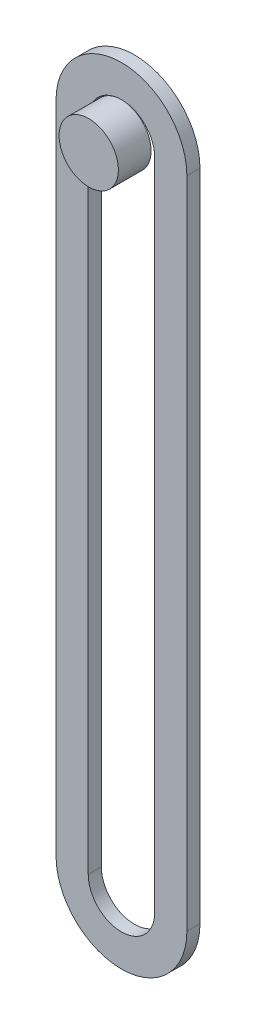
ISO-10303-21;
HEADER;
FILE_DESCRIPTION(('STEP AP214'),'2;1');
FILE_NAME('part.step','',(''),(''),'','','');
FILE_SCHEMA(('AUTOMOTIVE_DESIGN { 1 0 10303 214 1 1 1 1 }'));
ENDSEC;
DATA;
#1=APPLICATION_CONTEXT('core data for automotive mechanical design processes');
#2=APPLICATION_PROTOCOL_DEFINITION('international standard','automotive_design',2000,#1);
#3=PRODUCT_CONTEXT('',#1,'mechanical');
#4=PRODUCT('Part','Part','',(#3));
#5=PRODUCT_RELATED_PRODUCT_CATEGORY('part','',(#4));
#6=PRODUCT_DEFINITION_FORMATION('','',#4);
#7=PRODUCT_DEFINITION_CONTEXT('part definition',#1,'design');
#8=PRODUCT_DEFINITION('design','',#6,#7);
#9=PRODUCT_DEFINITION_SHAPE('','',#8);
#10=(LENGTH_UNIT() NAMED_UNIT(*) SI_UNIT(.MILLI.,.METRE.));
#11=(NAMED_UNIT(*) PLANE_ANGLE_UNIT() SI_UNIT($,.RADIAN.));
#12=(NAMED_UNIT(*) SI_UNIT($,.STERADIAN.) SOLID_ANGLE_UNIT());
#13=UNCERTAINTY_MEASURE_WITH_UNIT(LENGTH_MEASURE(1.E-05),#10,'distance_accuracy_value','');
#14=(GEOMETRIC_REPRESENTATION_CONTEXT(3) GLOBAL_UNCERTAINTY_ASSIGNED_CONTEXT((#13)) GLOBAL_UNIT_ASSIGNED_CONTEXT((#10,
#11,#12)) REPRESENTATION_CONTEXT('',''));
#15=CARTESIAN_POINT('',(0.,0.,0.));
#16=DIRECTION('',(0.,0.,1.));
#17=DIRECTION('',(1.,0.,0.));
#18=AXIS2_PLACEMENT_3D('',#15,#16,#17);
#19=CARTESIAN_POINT('',(-3.88578058618805E-13,44.4928273229244,7.00000000000001));
#20=DIRECTION('',(0.,0.,-0.999999999999996));
#21=DIRECTION('',(-1.,0.,0.));
#22=AXIS2_PLACEMENT_3D('',#19,#20,#21);
#23=CYLINDRICAL_SURFACE('',#22,4.53197925602349);
#24=CARTESIAN_POINT('',(-3.88578058618805E-13,44.4928273229244,7.00000000000001));
#25=DIRECTION('',(0.,0.,0.999999999999996));
#26=DIRECTION('',(1.,0.,0.));
#27=AXIS2_PLACEMENT_3D('',#24,#25,#26);
#28=CIRCLE('',#27,4.53197925602349);
#29=CARTESIAN_POINT('',(-4.53197925602388,44.4928273229244,7.00000000000001));
#30=VERTEX_POINT('',#29);
#31=EDGE_CURVE('E11',#30,#30,#28,.T.);
#32=CARTESIAN_POINT('',(-3.88578058618805E-13,44.4928273229244,2.));
#33=DIRECTION('',(0.,0.,0.999999999999996));
#34=DIRECTION('',(1.,0.,0.));
#35=AXIS2_PLACEMENT_3D('',#32,#33,#34);
#36=CIRCLE('',#35,4.53197925602349);
#37=CARTESIAN_POINT('',(-4.53197925602388,44.4928273229244,2.));
#38=VERTEX_POINT('',#37);
#39=EDGE_CURVE('E55',#38,#38,#36,.T.);
#40=CARTESIAN_POINT('',(-4.53197925602388,44.4928273229244,7.00000000000001));
#41=CARTESIAN_POINT('',(-4.53197925602388,44.4928273229244,6.94791666666667));
#42=CARTESIAN_POINT('',(-4.53197925602388,44.4928273229244,6.89583333333334));
#43=CARTESIAN_POINT('',(-4.53197925602388,44.4928273229244,6.79166666666667));
#44=CARTESIAN_POINT('',(-4.53197925602388,44.4928273229244,6.73958333333334));
#45=CARTESIAN_POINT('',(-4.53197925602388,44.4928273229244,6.63541666666667));
#46=CARTESIAN_POINT('',(-4.53197925602388,44.4928273229244,6.58333333333334));
#47=CARTESIAN_POINT('',(-4.53197925602388,44.4928273229244,6.47916666666667));
#48=CARTESIAN_POINT('',(-4.53197925602388,44.4928273229244,6.42708333333334));
#49=CARTESIAN_POINT('',(-4.53197925602388,44.4928273229244,6.32291666666667));
#50=CARTESIAN_POINT('',(-4.53197925602388,44.4928273229244,6.27083333333334));
#51=CARTESIAN_POINT('',(-4.53197925602388,44.4928273229244,6.16666666666667));
#52=CARTESIAN_POINT('',(-4.53197925602388,44.4928273229244,6.11458333333334));
#53=CARTESIAN_POINT('',(-4.53197925602388,44.4928273229244,6.01041666666667));
#54=CARTESIAN_POINT('',(-4.53197925602388,44.4928273229244,5.95833333333334));
#55=CARTESIAN_POINT('',(-4.53197925602388,44.4928273229244,5.85416666666667));
#56=CARTESIAN_POINT('',(-4.53197925602388,44.4928273229244,5.80208333333334));
#57=CARTESIAN_POINT('',(-4.53197925602388,44.4928273229244,5.69791666666667));
#58=CARTESIAN_POINT('',(-4.53197925602388,44.4928273229244,5.64583333333334));
#59=CARTESIAN_POINT('',(-4.53197925602388,44.4928273229244,5.54166666666667));
#60=CARTESIAN_POINT('',(-4.53197925602388,44.4928273229244,5.48958333333334));
#61=CARTESIAN_POINT('',(-4.53197925602388,44.4928273229244,5.38541666666667));
#62=CARTESIAN_POINT('',(-4.53197925602388,44.4928273229244,5.33333333333334));
#63=CARTESIAN_POINT('',(-4.53197925602388,44.4928273229244,5.22916666666667));
#64=CARTESIAN_POINT('',(-4.53197925602388,44.4928273229244,5.17708333333334));
#65=CARTESIAN_POINT('',(-4.53197925602388,44.4928273229244,5.07291666666667));
#66=CARTESIAN_POINT('',(-4.53197925602388,44.4928273229244,5.02083333333334));
#67=CARTESIAN_POINT('',(-4.53197925602388,44.4928273229244,4.91666666666667));
#68=CARTESIAN_POINT('',(-4.53197925602388,44.4928273229244,4.86458333333334));
#69=CARTESIAN_POINT('',(-4.53197925602388,44.4928273229244,4.76041666666667));
#70=CARTESIAN_POINT('',(-4.53197925602388,44.4928273229244,4.70833333333334));
#71=CARTESIAN_POINT('',(-4.53197925602388,44.4928273229244,4.60416666666667));
#72=CARTESIAN_POINT('',(-4.53197925602388,44.4928273229244,4.55208333333334));
#73=CARTESIAN_POINT('',(-4.53197925602388,44.4928273229244,4.44791666666667));
#74=CARTESIAN_POINT('',(-4.53197925602388,44.4928273229244,4.39583333333334));
#75=CARTESIAN_POINT('',(-4.53197925602388,44.4928273229244,4.29166666666667));
#76=CARTESIAN_POINT('',(-4.53197925602388,44.4928273229244,4.23958333333334));
#77=CARTESIAN_POINT('',(-4.53197925602388,44.4928273229244,4.13541666666667));
#78=CARTESIAN_POINT('',(-4.53197925602388,44.4928273229244,4.08333333333334));
#79=CARTESIAN_POINT('',(-4.53197925602388,44.4928273229244,3.97916666666667));
#80=CARTESIAN_POINT('',(-4.53197925602388,44.4928273229244,3.92708333333334));
#81=CARTESIAN_POINT('',(-4.53197925602388,44.4928273229244,3.82291666666667));
#82=CARTESIAN_POINT('',(-4.53197925602388,44.4928273229244,3.77083333333334));
#83=CARTESIAN_POINT('',(-4.53197925602388,44.4928273229244,3.66666666666667));
#84=CARTESIAN_POINT('',(-4.53197925602388,44.4928273229244,3.61458333333334));
#85=CARTESIAN_POINT('',(-4.53197925602388,44.4928273229244,3.51041666666667));
#86=CARTESIAN_POINT('',(-4.53197925602388,44.4928273229244,3.45833333333334));
#87=CARTESIAN_POINT('',(-4.53197925602388,44.4928273229244,3.35416666666667));
#88=CARTESIAN_POINT('',(-4.53197925602388,44.4928273229244,3.30208333333334));
#89=CARTESIAN_POINT('',(-4.53197925602388,44.4928273229244,3.19791666666667));
#90=CARTESIAN_POINT('',(-4.53197925602388,44.4928273229244,3.14583333333334));
#91=CARTESIAN_POINT('',(-4.53197925602388,44.4928273229244,3.04166666666667));
#92=CARTESIAN_POINT('',(-4.53197925602388,44.4928273229244,2.98958333333333));
#93=CARTESIAN_POINT('',(-4.53197925602388,44.4928273229244,2.88541666666667));
#94=CARTESIAN_POINT('',(-4.53197925602388,44.4928273229244,2.83333333333333));
#95=CARTESIAN_POINT('',(-4.53197925602388,44.4928273229244,2.72916666666667));
#96=CARTESIAN_POINT('',(-4.53197925602388,44.4928273229244,2.67708333333333));
#97=CARTESIAN_POINT('',(-4.53197925602388,44.4928273229244,2.57291666666667));
#98=CARTESIAN_POINT('',(-4.53197925602388,44.4928273229244,2.52083333333333));
#99=CARTESIAN_POINT('',(-4.53197925602388,44.4928273229244,2.41666666666667));
#100=CARTESIAN_POINT('',(-4.53197925602388,44.4928273229244,2.36458333333333));
#101=CARTESIAN_POINT('',(-4.53197925602388,44.4928273229244,2.26041666666667));
#102=CARTESIAN_POINT('',(-4.53197925602388,44.4928273229244,2.20833333333333));
#103=CARTESIAN_POINT('',(-4.53197925602388,44.4928273229244,2.10416666666667));
#104=CARTESIAN_POINT('',(-4.53197925602388,44.4928273229244,2.05208333333333));
#105=CARTESIAN_POINT('',(-4.53197925602388,44.4928273229244,2.));
#106=B_SPLINE_CURVE_WITH_KNOTS('',3,(#40,#41,#42,#43,#44,#45,#46,#47,#48,#49,#50,#51,#52,#53,
#54,#55,#56,#57,#58,#59,#60,#61,#62,#63,#64,#65,#66,#67,#68,#69,#70,#71,#72,#73,#74,#75,#76,#77,
#78,#79,#80,#81,#82,#83,#84,#85,#86,#87,#88,#89,#90,#91,#92,#93,#94,#95,#96,#97,#98,#99,#100,
#101,#102,#103,#104,#105),.UNSPECIFIED.,.F.,.F.,(4,2,2,2,2,2,2,2,2,2,2,2,2,2,2,2,2,2,2,2,2,2,2,
2,2,2,2,2,2,2,2,2,4),(0.,0.156249999999999,0.312499999999999,0.46875,0.625,0.78125,0.9375,
1.09375,1.25,1.40625,1.5625,1.71875,1.875,2.03125,2.1875,2.34375,2.5,2.65625,2.8125,2.96875,
3.125,3.28125,3.4375,3.59375,3.75,3.90625,4.0625,4.21875,4.375,4.53125,4.6875,4.84375,5.),.UNSPECIFIED.);
#107=EDGE_CURVE('BSEAM52',#30,#38,#106,.T.);
#108=ORIENTED_EDGE('',*,*,#31,.F.);
#109=ORIENTED_EDGE('',*,*,#39,.T.);
#110=ORIENTED_EDGE('',*,*,#107,.T.);
#111=ORIENTED_EDGE('',*,*,#107,.F.);
#112=EDGE_LOOP('',(#108,#110,#109,#111));
#113=FACE_BOUND('',#112,.T.);
#114=ADVANCED_FACE('F52',(#113),#23,.T.);
#115=CARTESIAN_POINT('',(-3.88578058618805E-13,44.4928273229244,7.00000000000001));
#116=DIRECTION('',(0.,0.,0.999999999999996));
#117=DIRECTION('',(1.,0.,0.));
#118=AXIS2_PLACEMENT_3D('',#115,#116,#117);
#119=PLANE('',#118);
#120=ORIENTED_EDGE('',*,*,#31,.T.);
#121=EDGE_LOOP('',(#120));
#122=FACE_BOUND('',#121,.T.);
#123=ADVANCED_FACE('F67',(#122),#119,.T.);
#124=CARTESIAN_POINT('',(-3.88578058618805E-13,44.4928273229244,2.));
#125=DIRECTION('',(0.,0.,0.999999999999996));
#126=DIRECTION('',(1.,0.,0.));
#127=AXIS2_PLACEMENT_3D('',#124,#125,#126);
#128=PLANE('',#127);
#129=ORIENTED_EDGE('',*,*,#39,.F.);
#130=EDGE_LOOP('',(#129));
#131=FACE_BOUND('',#130,.T.);
#132=ADVANCED_FACE('F65',(#131),#128,.F.);
#133=CLOSED_SHELL('',(#114,#123,#132));
#134=MANIFOLD_SOLID_BREP('B2',#133);
#135=CARTESIAN_POINT('',(1.11022302462516E-13,-56.0526315789476,2.));
#136=DIRECTION('',(0.,0.,0.999999999999996));
#137=DIRECTION('',(1.,0.,0.));
#138=AXIS2_PLACEMENT_3D('',#135,#136,#137);
#139=PLANE('',#138);
#140=CARTESIAN_POINT('',(1.11022302462516E-13,-56.0526315789476,2.));
#141=DIRECTION('',(0.,0.,0.999999999999996));
#142=DIRECTION('',(1.,0.,0.));
#143=AXIS2_PLACEMENT_3D('',#140,#141,#142);
#144=CIRCLE('',#143,10.);
#145=CARTESIAN_POINT('',(-9.9999999999999,-56.0526315789474,2.));
#146=VERTEX_POINT('',#145);
#147=CARTESIAN_POINT('',(10.0000000000002,-56.052631578948,2.));
#148=VERTEX_POINT('',#147);
#149=EDGE_CURVE('E196',#146,#148,#144,.T.);
#150=ORIENTED_EDGE('',*,*,#149,.T.);
#151=DIRECTION('',(0.,1.,0.));
#152=VECTOR('',#151,1.);
#153=CARTESIAN_POINT('',(10.0000000000002,-56.052631578948,2.));
#154=LINE('',#153,#152);
#155=CARTESIAN_POINT('',(9.99999999999956,43.947368421053,2.00000000000025));
#156=VERTEX_POINT('',#155);
#157=EDGE_CURVE('E199',#148,#156,#154,.T.);
#158=ORIENTED_EDGE('',*,*,#157,.T.);
#159=CARTESIAN_POINT('',(-5.55111512312578E-13,43.9473684210527,2.));
#160=DIRECTION('',(0.,0.,0.999999999999996));
#161=DIRECTION('',(1.,0.,0.));
#162=AXIS2_PLACEMENT_3D('',#159,#160,#161);
#163=CIRCLE('',#162,10.);
#164=CARTESIAN_POINT('',(-9.9999999999999,43.9473684210532,2.));
#165=VERTEX_POINT('',#164);
#166=EDGE_CURVE('E202',#156,#165,#163,.T.);
#167=ORIENTED_EDGE('',*,*,#166,.T.);
#168=DIRECTION('',(0.,-1.,0.));
#169=VECTOR('',#168,1.);
#170=CARTESIAN_POINT('',(-9.9999999999999,-56.0526315789474,2.));
#171=LINE('',#170,#169);
#172=EDGE_CURVE('E204',#165,#146,#171,.T.);
#173=ORIENTED_EDGE('',*,*,#172,.T.);
#174=EDGE_LOOP('',(#150,#158,#167,#173));
#175=FACE_BOUND('',#174,.T.);
#176=DIRECTION('',(0.,1.,0.));
#177=VECTOR('',#176,1.);
#178=CARTESIAN_POINT('',(5.07743815789474,-56.0526315789474,2.));
#179=LINE('',#178,#177);
#180=CARTESIAN_POINT('',(5.07743815789474,-56.0526315789474,2.));
#181=VERTEX_POINT('',#180);
#182=CARTESIAN_POINT('',(5.07743815789491,43.9473684210525,2.));
#183=VERTEX_POINT('',#182);
#184=EDGE_CURVE('E167',#181,#183,#179,.T.);
#185=ORIENTED_EDGE('',*,*,#184,.F.);
#186=CARTESIAN_POINT('',(1.11022302462516E-13,-56.0526315789476,2.));
#187=DIRECTION('',(0.,0.,0.999999999999996));
#188=DIRECTION('',(1.,0.,0.));
#189=AXIS2_PLACEMENT_3D('',#186,#187,#188);
#190=CIRCLE('',#189,5.07743815789471);
#191=CARTESIAN_POINT('',(-5.07743815789452,-56.0526315789478,2.));
#192=VERTEX_POINT('',#191);
#193=EDGE_CURVE('E159',#192,#181,#190,.T.);
#194=ORIENTED_EDGE('',*,*,#193,.F.);
#195=DIRECTION('',(0.,-1.,0.));
#196=VECTOR('',#195,1.);
#197=CARTESIAN_POINT('',(-5.07743815789452,-56.0526315789478,2.));
#198=LINE('',#197,#196);
#199=CARTESIAN_POINT('',(-5.07743815789502,43.9473684210536,2.00000000000025));
#200=VERTEX_POINT('',#199);
#201=EDGE_CURVE('E182',#200,#192,#198,.T.);
#202=ORIENTED_EDGE('',*,*,#201,.F.);
#203=CARTESIAN_POINT('',(-5.55111512312578E-13,43.9473684210527,2.));
#204=DIRECTION('',(0.,0.,0.999999999999996));
#205=DIRECTION('',(1.,0.,0.));
#206=AXIS2_PLACEMENT_3D('',#203,#204,#205);
#207=CIRCLE('',#206,5.07743815789471);
#208=CARTESIAN_POINT('',(-3.33066907387547E-13,49.024806578948,2.));
#209=VERTEX_POINT('',#208);
#210=EDGE_CURVE('E106',#209,#200,#207,.T.);
#211=ORIENTED_EDGE('',*,*,#210,.F.);
#212=EDGE_CURVE('E178',#183,#209,#207,.T.);
#213=ORIENTED_EDGE('',*,*,#212,.F.);
#214=EDGE_LOOP('',(#185,#194,#202,#211,#213));
#215=FACE_BOUND('',#214,.T.);
#216=ADVANCED_FACE('F91',(#175,#215),#139,.T.);
#217=CARTESIAN_POINT('',(1.11022302462516E-13,-56.0526315789476,0.));
#218=DIRECTION('',(0.,0.,0.999999999999996));
#219=DIRECTION('',(1.,0.,0.));
#220=AXIS2_PLACEMENT_3D('',#217,#218,#219);
#221=PLANE('',#220);
#222=CARTESIAN_POINT('',(1.11022302462516E-13,-56.0526315789476,0.));
#223=DIRECTION('',(0.,0.,0.999999999999996));
#224=DIRECTION('',(1.,0.,0.));
#225=AXIS2_PLACEMENT_3D('',#222,#223,#224);
#226=CIRCLE('',#225,10.);
#227=CARTESIAN_POINT('',(-9.9999999999999,-56.0526315789474,0.));
#228=VERTEX_POINT('',#227);
#229=CARTESIAN_POINT('',(10.0000000000002,-56.052631578948,0.));
#230=VERTEX_POINT('',#229);
#231=EDGE_CURVE('E175',#228,#230,#226,.T.);
#232=ORIENTED_EDGE('',*,*,#231,.F.);
#233=DIRECTION('',(0.,-1.,0.));
#234=VECTOR('',#233,1.);
#235=CARTESIAN_POINT('',(-9.9999999999999,-56.0526315789474,0.));
#236=LINE('',#235,#234);
#237=CARTESIAN_POINT('',(-9.9999999999999,43.9473684210532,0.));
#238=VERTEX_POINT('',#237);
#239=EDGE_CURVE('E200',#238,#228,#236,.T.);
#240=ORIENTED_EDGE('',*,*,#239,.F.);
#241=CARTESIAN_POINT('',(-5.55111512312578E-13,43.9473684210527,0.));
#242=DIRECTION('',(0.,0.,0.999999999999996));
#243=DIRECTION('',(1.,0.,0.));
#244=AXIS2_PLACEMENT_3D('',#241,#242,#243);
#245=CIRCLE('',#244,10.);
#246=CARTESIAN_POINT('',(9.99999999999984,43.9473684210527,2.4980018054066E-13));
#247=VERTEX_POINT('',#246);
#248=EDGE_CURVE('E211',#247,#238,#245,.T.);
#249=ORIENTED_EDGE('',*,*,#248,.F.);
#250=DIRECTION('',(0.,1.,0.));
#251=VECTOR('',#250,1.);
#252=CARTESIAN_POINT('',(10.0000000000002,-56.052631578948,0.));
#253=LINE('',#252,#251);
#254=EDGE_CURVE('E209',#230,#247,#253,.T.);
#255=ORIENTED_EDGE('',*,*,#254,.F.);
#256=EDGE_LOOP('',(#232,#240,#249,#255));
#257=FACE_BOUND('',#256,.T.);
#258=CARTESIAN_POINT('',(1.11022302462516E-13,-56.0526315789476,0.));
#259=DIRECTION('',(0.,0.,0.999999999999996));
#260=DIRECTION('',(1.,0.,0.));
#261=AXIS2_PLACEMENT_3D('',#258,#259,#260);
#262=CIRCLE('',#261,5.07743815789471);
#263=CARTESIAN_POINT('',(-5.07743815789452,-56.0526315789478,0.));
#264=VERTEX_POINT('',#263);
#265=CARTESIAN_POINT('',(5.07743815789474,-56.0526315789474,0.));
#266=VERTEX_POINT('',#265);
#267=EDGE_CURVE('E184',#264,#266,#262,.T.);
#268=ORIENTED_EDGE('',*,*,#267,.T.);
#269=DIRECTION('',(0.,1.,0.));
#270=VECTOR('',#269,1.);
#271=CARTESIAN_POINT('',(5.07743815789474,-56.0526315789474,0.));
#272=LINE('',#271,#270);
#273=CARTESIAN_POINT('',(5.07743815789491,43.9473684210525,0.));
#274=VERTEX_POINT('',#273);
#275=EDGE_CURVE('E174',#266,#274,#272,.T.);
#276=ORIENTED_EDGE('',*,*,#275,.T.);
#277=CARTESIAN_POINT('',(-5.55111512312578E-13,43.9473684210527,0.));
#278=DIRECTION('',(0.,0.,0.999999999999996));
#279=DIRECTION('',(1.,0.,0.));
#280=AXIS2_PLACEMENT_3D('',#277,#278,#279);
#281=CIRCLE('',#280,5.07743815789471);
#282=CARTESIAN_POINT('',(-5.07743815789502,43.9473684210536,2.4980018054066E-13));
#283=VERTEX_POINT('',#282);
#284=EDGE_CURVE('E187',#274,#283,#281,.T.);
#285=ORIENTED_EDGE('',*,*,#284,.T.);
#286=DIRECTION('',(0.,-1.,0.));
#287=VECTOR('',#286,1.);
#288=CARTESIAN_POINT('',(-5.07743815789452,-56.0526315789478,0.));
#289=LINE('',#288,#287);
#290=EDGE_CURVE('E168',#283,#264,#289,.T.);
#291=ORIENTED_EDGE('',*,*,#290,.T.);
#292=EDGE_LOOP('',(#268,#276,#285,#291));
#293=FACE_BOUND('',#292,.T.);
#294=ADVANCED_FACE('F229',(#257,#293),#221,.F.);
#295=CARTESIAN_POINT('',(1.11022302462516E-13,-56.0526315789476,2.));
#296=DIRECTION('',(0.,0.,-0.999999999999996));
#297=DIRECTION('',(-1.,0.,0.));
#298=AXIS2_PLACEMENT_3D('',#295,#296,#297);
#299=CYLINDRICAL_SURFACE('',#298,10.);
#300=ORIENTED_EDGE('',*,*,#231,.T.);
#301=DIRECTION('',(0.,0.,-0.999999999999996));
#302=VECTOR('',#301,1.);
#303=CARTESIAN_POINT('',(10.0000000000002,-56.052631578948,2.));
#304=LINE('',#303,#302);
#305=EDGE_CURVE('E50',#148,#230,#304,.T.);
#306=ORIENTED_EDGE('',*,*,#305,.F.);
#307=ORIENTED_EDGE('',*,*,#149,.F.);
#308=DIRECTION('',(0.,0.,-0.999999999999996));
#309=VECTOR('',#308,1.);
#310=CARTESIAN_POINT('',(-9.9999999999999,-56.0526315789474,2.));
#311=LINE('',#310,#309);
#312=EDGE_CURVE('E206',#146,#228,#311,.T.);
#313=ORIENTED_EDGE('',*,*,#312,.T.);
#314=EDGE_LOOP('',(#300,#306,#307,#313));
#315=FACE_BOUND('',#314,.T.);
#316=ADVANCED_FACE('F93',(#315),#299,.T.);
#317=CARTESIAN_POINT('',(10.0000000000002,-56.052631578948,2.));
#318=DIRECTION('',(-1.,0.,0.));
#319=DIRECTION('',(0.,0.,0.999999999999996));
#320=AXIS2_PLACEMENT_3D('',#317,#318,#319);
#321=PLANE('',#320);
#322=ORIENTED_EDGE('',*,*,#254,.T.);
#323=DIRECTION('',(0.,0.,-0.999999999999996));
#324=VECTOR('',#323,1.);
#325=CARTESIAN_POINT('',(9.99999999999956,43.947368421053,2.00000000000025));
#326=LINE('',#325,#324);
#327=EDGE_CURVE('E99',#156,#247,#326,.T.);
#328=ORIENTED_EDGE('',*,*,#327,.F.);
#329=ORIENTED_EDGE('',*,*,#157,.F.);
#330=ORIENTED_EDGE('',*,*,#305,.T.);
#331=EDGE_LOOP('',(#322,#328,#329,#330));
#332=FACE_BOUND('',#331,.T.);
#333=ADVANCED_FACE('F239',(#332),#321,.F.);
#334=CARTESIAN_POINT('',(-5.55111512312578E-13,43.9473684210527,2.));
#335=DIRECTION('',(0.,0.,-0.999999999999996));
#336=DIRECTION('',(-1.,0.,0.));
#337=AXIS2_PLACEMENT_3D('',#334,#335,#336);
#338=CYLINDRICAL_SURFACE('',#337,10.);
#339=ORIENTED_EDGE('',*,*,#248,.T.);
#340=DIRECTION('',(0.,0.,-0.999999999999996));
#341=VECTOR('',#340,1.);
#342=CARTESIAN_POINT('',(-9.9999999999999,43.9473684210532,2.));
#343=LINE('',#342,#341);
#344=EDGE_CURVE('E216',#165,#238,#343,.T.);
#345=ORIENTED_EDGE('',*,*,#344,.F.);
#346=ORIENTED_EDGE('',*,*,#166,.F.);
#347=ORIENTED_EDGE('',*,*,#327,.T.);
#348=EDGE_LOOP('',(#339,#345,#346,#347));
#349=FACE_BOUND('',#348,.T.);
#350=ADVANCED_FACE('F223',(#349),#338,.T.);
#351=CARTESIAN_POINT('',(-9.9999999999999,-56.0526315789474,2.));
#352=DIRECTION('',(1.,0.,0.));
#353=DIRECTION('',(0.,0.,-0.999999999999996));
#354=AXIS2_PLACEMENT_3D('',#351,#352,#353);
#355=PLANE('',#354);
#356=ORIENTED_EDGE('',*,*,#239,.T.);
#357=ORIENTED_EDGE('',*,*,#312,.F.);
#358=ORIENTED_EDGE('',*,*,#172,.F.);
#359=ORIENTED_EDGE('',*,*,#344,.T.);
#360=EDGE_LOOP('',(#356,#357,#358,#359));
#361=FACE_BOUND('',#360,.T.);
#362=ADVANCED_FACE('F233',(#361),#355,.F.);
#363=CARTESIAN_POINT('',(1.11022302462516E-13,-56.0526315789476,2.));
#364=DIRECTION('',(0.,0.,-0.999999999999996));
#365=DIRECTION('',(-1.,0.,0.));
#366=AXIS2_PLACEMENT_3D('',#363,#364,#365);
#367=CYLINDRICAL_SURFACE('',#366,5.07743815789471);
#368=ORIENTED_EDGE('',*,*,#267,.F.);
#369=DIRECTION('',(0.,0.,-0.999999999999996));
#370=VECTOR('',#369,1.);
#371=CARTESIAN_POINT('',(-5.07743815789452,-56.0526315789478,2.));
#372=LINE('',#371,#370);
#373=EDGE_CURVE('E165',#192,#264,#372,.T.);
#374=ORIENTED_EDGE('',*,*,#373,.F.);
#375=ORIENTED_EDGE('',*,*,#193,.T.);
#376=DIRECTION('',(0.,0.,-0.999999999999996));
#377=VECTOR('',#376,1.);
#378=CARTESIAN_POINT('',(5.07743815789474,-56.0526315789474,2.));
#379=LINE('',#378,#377);
#380=EDGE_CURVE('E162',#181,#266,#379,.T.);
#381=ORIENTED_EDGE('',*,*,#380,.T.);
#382=EDGE_LOOP('',(#368,#374,#375,#381));
#383=FACE_BOUND('',#382,.T.);
#384=ADVANCED_FACE('F161',(#383),#367,.F.);
#385=CARTESIAN_POINT('',(5.07743815789474,-56.0526315789474,2.));
#386=DIRECTION('',(-1.,0.,0.));
#387=DIRECTION('',(0.,0.,0.999999999999996));
#388=AXIS2_PLACEMENT_3D('',#385,#386,#387);
#389=PLANE('',#388);
#390=ORIENTED_EDGE('',*,*,#275,.F.);
#391=ORIENTED_EDGE('',*,*,#380,.F.);
#392=ORIENTED_EDGE('',*,*,#184,.T.);
#393=DIRECTION('',(0.,0.,-0.999999999999996));
#394=VECTOR('',#393,1.);
#395=CARTESIAN_POINT('',(5.07743815789491,43.9473684210525,2.));
#396=LINE('',#395,#394);
#397=EDGE_CURVE('E176',#183,#274,#396,.T.);
#398=ORIENTED_EDGE('',*,*,#397,.T.);
#399=EDGE_LOOP('',(#390,#391,#392,#398));
#400=FACE_BOUND('',#399,.T.);
#401=ADVANCED_FACE('F171',(#400),#389,.T.);
#402=CARTESIAN_POINT('',(-5.55111512312578E-13,43.9473684210527,2.));
#403=DIRECTION('',(0.,0.,-0.999999999999996));
#404=DIRECTION('',(-1.,0.,0.));
#405=AXIS2_PLACEMENT_3D('',#402,#403,#404);
#406=CYLINDRICAL_SURFACE('',#405,5.07743815789471);
#407=ORIENTED_EDGE('',*,*,#284,.F.);
#408=ORIENTED_EDGE('',*,*,#397,.F.);
#409=ORIENTED_EDGE('',*,*,#212,.T.);
#410=ORIENTED_EDGE('',*,*,#210,.T.);
#411=DIRECTION('',(0.,0.,-0.999999999999996));
#412=VECTOR('',#411,1.);
#413=CARTESIAN_POINT('',(-5.07743815789502,43.9473684210536,2.00000000000025));
#414=LINE('',#413,#412);
#415=EDGE_CURVE('E193',#200,#283,#414,.T.);
#416=ORIENTED_EDGE('',*,*,#415,.T.);
#417=EDGE_LOOP('',(#407,#408,#409,#410,#416));
#418=FACE_BOUND('',#417,.T.);
#419=ADVANCED_FACE('F262',(#418),#406,.F.);
#420=CARTESIAN_POINT('',(-5.07743815789452,-56.0526315789478,2.));
#421=DIRECTION('',(1.,0.,0.));
#422=DIRECTION('',(0.,0.,-0.999999999999996));
#423=AXIS2_PLACEMENT_3D('',#420,#421,#422);
#424=PLANE('',#423);
#425=ORIENTED_EDGE('',*,*,#290,.F.);
#426=ORIENTED_EDGE('',*,*,#415,.F.);
#427=ORIENTED_EDGE('',*,*,#201,.T.);
#428=ORIENTED_EDGE('',*,*,#373,.T.);
#429=EDGE_LOOP('',(#425,#426,#427,#428));
#430=FACE_BOUND('',#429,.T.);
#431=ADVANCED_FACE('F266',(#430),#424,.T.);
#432=CLOSED_SHELL('',(#216,#294,#316,#333,#350,#362,#384,#401,#419,#431));
#433=MANIFOLD_SOLID_BREP('B6',#432);
#434=ADVANCED_BREP_SHAPE_REPRESENTATION('',(#18,#134,#433),#14);
#435=SHAPE_DEFINITION_REPRESENTATION(#9,#434);
ENDSEC;
END-ISO-10303-21;
